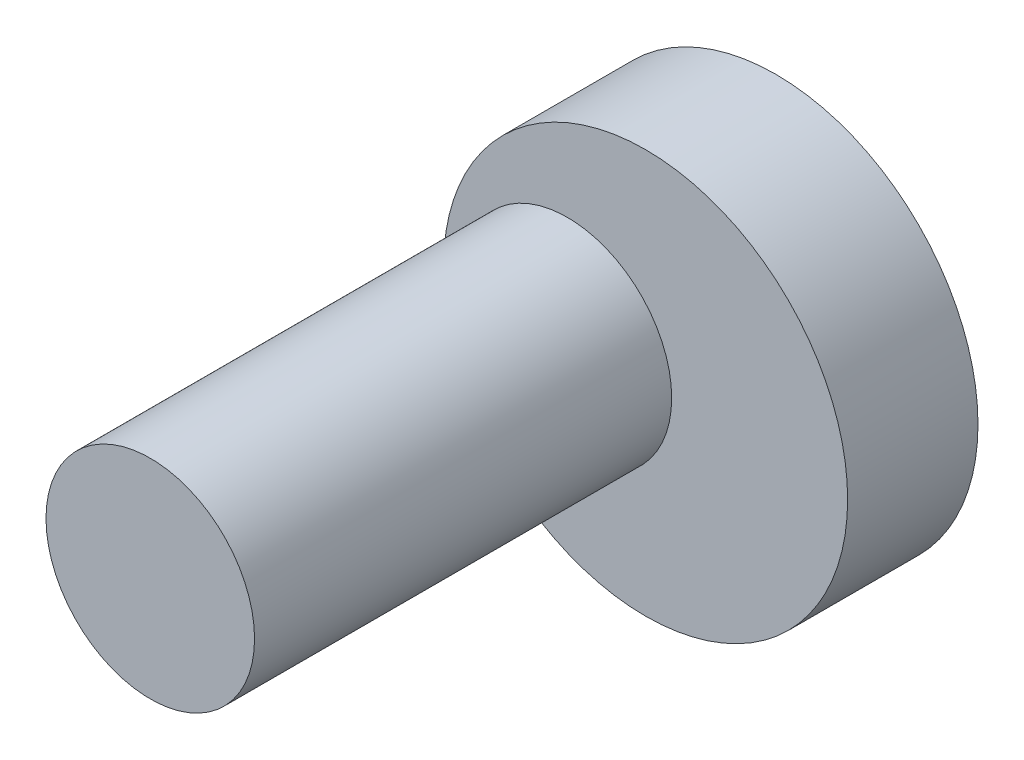
ISO-10303-21;
HEADER;
FILE_DESCRIPTION(('STEP AP214'),'2;1');
FILE_NAME('part.step','',(''),(''),'','','');
FILE_SCHEMA(('AUTOMOTIVE_DESIGN { 1 0 10303 214 1 1 1 1 }'));
ENDSEC;
DATA;
#1=APPLICATION_CONTEXT('core data for automotive mechanical design processes');
#2=APPLICATION_PROTOCOL_DEFINITION('international standard','automotive_design',2000,#1);
#3=PRODUCT_CONTEXT('',#1,'mechanical');
#4=PRODUCT('Part','Part','',(#3));
#5=PRODUCT_RELATED_PRODUCT_CATEGORY('part','',(#4));
#6=PRODUCT_DEFINITION_FORMATION('','',#4);
#7=PRODUCT_DEFINITION_CONTEXT('part definition',#1,'design');
#8=PRODUCT_DEFINITION('design','',#6,#7);
#9=PRODUCT_DEFINITION_SHAPE('','',#8);
#10=(LENGTH_UNIT() NAMED_UNIT(*) SI_UNIT(.MILLI.,.METRE.));
#11=(NAMED_UNIT(*) PLANE_ANGLE_UNIT() SI_UNIT($,.RADIAN.));
#12=(NAMED_UNIT(*) SI_UNIT($,.STERADIAN.) SOLID_ANGLE_UNIT());
#13=UNCERTAINTY_MEASURE_WITH_UNIT(LENGTH_MEASURE(1.E-05),#10,'distance_accuracy_value','');
#14=(GEOMETRIC_REPRESENTATION_CONTEXT(3) GLOBAL_UNCERTAINTY_ASSIGNED_CONTEXT((#13)) GLOBAL_UNIT_ASSIGNED_CONTEXT((#10,
#11,#12)) REPRESENTATION_CONTEXT('',''));
#15=CARTESIAN_POINT('',(0.,0.,0.));
#16=DIRECTION('',(0.,0.,1.));
#17=DIRECTION('',(1.,0.,0.));
#18=AXIS2_PLACEMENT_3D('',#15,#16,#17);
#19=CARTESIAN_POINT('',(0.,0.,10.));
#20=DIRECTION('',(0.,0.,-1.));
#21=DIRECTION('',(-1.,0.,0.));
#22=AXIS2_PLACEMENT_3D('',#19,#20,#21);
#23=CYLINDRICAL_SURFACE('',#22,15.5);
#24=CARTESIAN_POINT('',(0.,0.,10.));
#25=DIRECTION('',(0.,0.,1.));
#26=DIRECTION('',(1.,0.,0.));
#27=AXIS2_PLACEMENT_3D('',#24,#25,#26);
#28=CIRCLE('',#27,15.5);
#29=CARTESIAN_POINT('',(15.5,0.,10.));
#30=VERTEX_POINT('',#29);
#31=EDGE_CURVE('E46',#30,#30,#28,.T.);
#32=ORIENTED_EDGE('',*,*,#31,.F.);
#33=EDGE_LOOP('',(#32));
#34=FACE_BOUND('',#33,.T.);
#35=CARTESIAN_POINT('',(0.,0.,0.));
#36=DIRECTION('',(0.,0.,1.));
#37=DIRECTION('',(1.,0.,0.));
#38=AXIS2_PLACEMENT_3D('',#35,#36,#37);
#39=CIRCLE('',#38,15.5);
#40=CARTESIAN_POINT('',(15.5,0.,0.));
#41=VERTEX_POINT('',#40);
#42=EDGE_CURVE('E42',#41,#41,#39,.T.);
#43=ORIENTED_EDGE('',*,*,#42,.T.);
#44=EDGE_LOOP('',(#43));
#45=FACE_BOUND('',#44,.T.);
#46=ADVANCED_FACE('F39',(#34,#45),#23,.T.);
#47=CARTESIAN_POINT('',(0.,0.,10.));
#48=DIRECTION('',(0.,0.,1.));
#49=DIRECTION('',(1.,0.,0.));
#50=AXIS2_PLACEMENT_3D('',#47,#48,#49);
#51=PLANE('',#50);
#52=CARTESIAN_POINT('',(-6.,0.,10.));
#53=DIRECTION('',(0.,0.,1.));
#54=DIRECTION('',(1.,0.,0.));
#55=AXIS2_PLACEMENT_3D('',#52,#53,#54);
#56=CIRCLE('',#55,8.);
#57=CARTESIAN_POINT('',(2.,0.,10.));
#58=VERTEX_POINT('',#57);
#59=EDGE_CURVE('E10',#58,#58,#56,.T.);
#60=ORIENTED_EDGE('',*,*,#59,.F.);
#61=EDGE_LOOP('',(#60));
#62=FACE_BOUND('',#61,.T.);
#63=ORIENTED_EDGE('',*,*,#31,.T.);
#64=EDGE_LOOP('',(#63));
#65=FACE_BOUND('',#64,.T.);
#66=ADVANCED_FACE('F63',(#62,#65),#51,.T.);
#67=CARTESIAN_POINT('',(0.,0.,0.));
#68=DIRECTION('',(0.,0.,1.));
#69=DIRECTION('',(1.,0.,0.));
#70=AXIS2_PLACEMENT_3D('',#67,#68,#69);
#71=PLANE('',#70);
#72=ORIENTED_EDGE('',*,*,#42,.F.);
#73=EDGE_LOOP('',(#72));
#74=FACE_BOUND('',#73,.T.);
#75=ADVANCED_FACE('F60',(#74),#71,.F.);
#76=CARTESIAN_POINT('',(-6.,0.,42.));
#77=DIRECTION('',(0.,0.,-1.));
#78=DIRECTION('',(-1.,0.,0.));
#79=AXIS2_PLACEMENT_3D('',#76,#77,#78);
#80=CYLINDRICAL_SURFACE('',#79,8.);
#81=CARTESIAN_POINT('',(-6.,0.,42.));
#82=DIRECTION('',(0.,0.,1.));
#83=DIRECTION('',(1.,0.,0.));
#84=AXIS2_PLACEMENT_3D('',#81,#82,#83);
#85=CIRCLE('',#84,8.);
#86=CARTESIAN_POINT('',(2.,0.,42.));
#87=VERTEX_POINT('',#86);
#88=EDGE_CURVE('E52',#87,#87,#85,.T.);
#89=ORIENTED_EDGE('',*,*,#88,.F.);
#90=EDGE_LOOP('',(#89));
#91=FACE_BOUND('',#90,.T.);
#92=ORIENTED_EDGE('',*,*,#59,.T.);
#93=EDGE_LOOP('',(#92));
#94=FACE_BOUND('',#93,.T.);
#95=ADVANCED_FACE('F62',(#91,#94),#80,.T.);
#96=CARTESIAN_POINT('',(-6.,0.,42.));
#97=DIRECTION('',(0.,0.,1.));
#98=DIRECTION('',(1.,0.,0.));
#99=AXIS2_PLACEMENT_3D('',#96,#97,#98);
#100=PLANE('',#99);
#101=ORIENTED_EDGE('',*,*,#88,.T.);
#102=EDGE_LOOP('',(#101));
#103=FACE_BOUND('',#102,.T.);
#104=ADVANCED_FACE('F69',(#103),#100,.T.);
#105=CLOSED_SHELL('',(#46,#66,#75,#95,#104));
#106=MANIFOLD_SOLID_BREP('B2',#105);
#107=ADVANCED_BREP_SHAPE_REPRESENTATION('',(#18,#106),#14);
#108=SHAPE_DEFINITION_REPRESENTATION(#9,#107);
ENDSEC;
END-ISO-10303-21;
